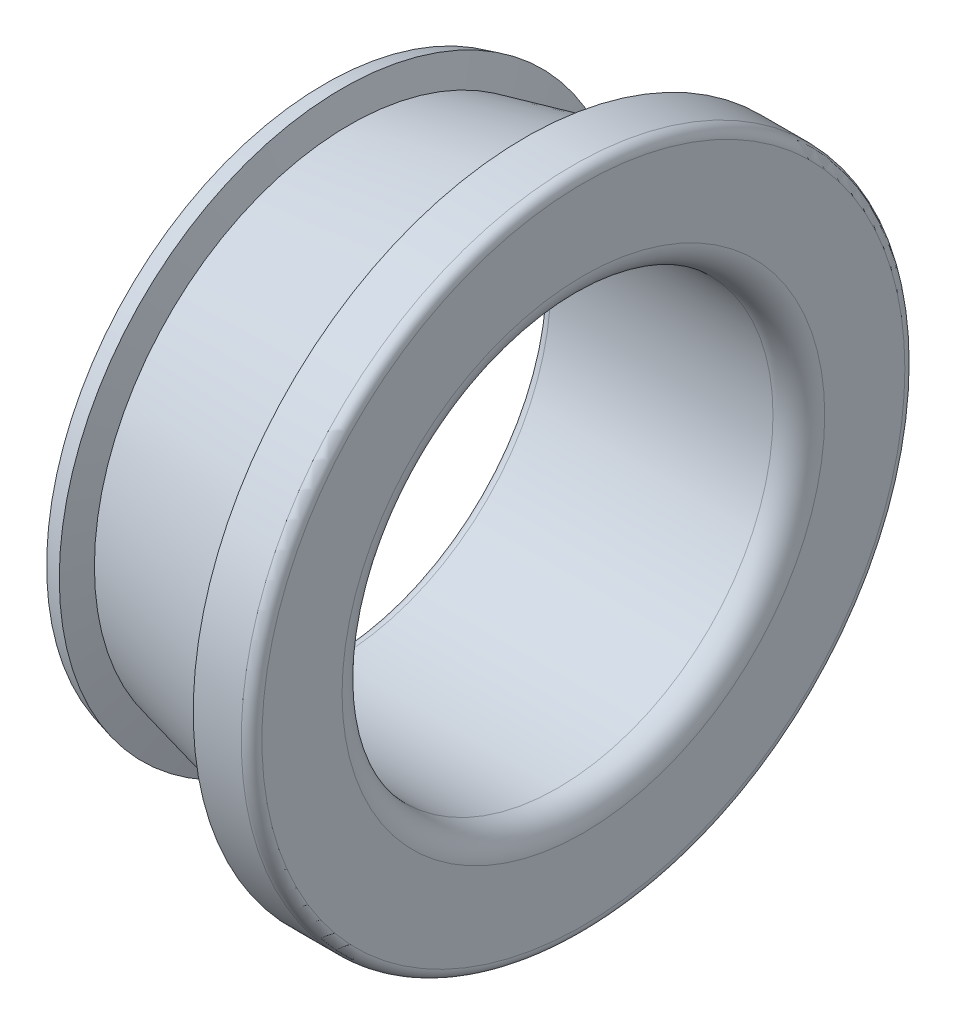
ISO-10303-21;
HEADER;
FILE_DESCRIPTION(('STEP AP214'),'2;1');
FILE_NAME('part.step','',(''),(''),'','','');
FILE_SCHEMA(('AUTOMOTIVE_DESIGN { 1 0 10303 214 1 1 1 1 }'));
ENDSEC;
DATA;
#1=APPLICATION_CONTEXT('core data for automotive mechanical design processes');
#2=APPLICATION_PROTOCOL_DEFINITION('international standard','automotive_design',2000,#1);
#3=PRODUCT_CONTEXT('',#1,'mechanical');
#4=PRODUCT('Part','Part','',(#3));
#5=PRODUCT_RELATED_PRODUCT_CATEGORY('part','',(#4));
#6=PRODUCT_DEFINITION_FORMATION('','',#4);
#7=PRODUCT_DEFINITION_CONTEXT('part definition',#1,'design');
#8=PRODUCT_DEFINITION('design','',#6,#7);
#9=PRODUCT_DEFINITION_SHAPE('','',#8);
#10=(LENGTH_UNIT() NAMED_UNIT(*) SI_UNIT(.MILLI.,.METRE.));
#11=(NAMED_UNIT(*) PLANE_ANGLE_UNIT() SI_UNIT($,.RADIAN.));
#12=(NAMED_UNIT(*) SI_UNIT($,.STERADIAN.) SOLID_ANGLE_UNIT());
#13=UNCERTAINTY_MEASURE_WITH_UNIT(LENGTH_MEASURE(1.E-05),#10,'distance_accuracy_value','');
#14=(GEOMETRIC_REPRESENTATION_CONTEXT(3) GLOBAL_UNCERTAINTY_ASSIGNED_CONTEXT((#13)) GLOBAL_UNIT_ASSIGNED_CONTEXT((#10,
#11,#12)) REPRESENTATION_CONTEXT('',''));
#15=CARTESIAN_POINT('',(0.,0.,0.));
#16=DIRECTION('',(0.,0.,1.));
#17=DIRECTION('',(1.,0.,0.));
#18=AXIS2_PLACEMENT_3D('',#15,#16,#17);
#19=CARTESIAN_POINT('',(-1.5,0.,0.));
#20=DIRECTION('',(1.,0.,0.));
#21=DIRECTION('',(0.,0.,-1.));
#22=AXIS2_PLACEMENT_3D('',#19,#20,#21);
#23=TOROIDAL_SURFACE('',#22,14.,1.5);
#24=CARTESIAN_POINT('',(0.,0.,0.));
#25=DIRECTION('',(1.,0.,0.));
#26=DIRECTION('',(0.,0.,-1.));
#27=AXIS2_PLACEMENT_3D('',#24,#25,#26);
#28=CIRCLE('',#27,14.);
#29=CARTESIAN_POINT('',(0.,0.,-14.));
#30=VERTEX_POINT('',#29);
#31=EDGE_CURVE('E68',#30,#30,#28,.T.);
#32=ORIENTED_EDGE('',*,*,#31,.T.);
#33=EDGE_LOOP('',(#32));
#34=FACE_BOUND('',#33,.T.);
#35=CARTESIAN_POINT('',(-1.5,0.,0.));
#36=DIRECTION('',(1.,0.,0.));
#37=DIRECTION('',(0.,0.,-1.));
#38=AXIS2_PLACEMENT_3D('',#35,#36,#37);
#39=CIRCLE('',#38,12.5);
#40=CARTESIAN_POINT('',(-1.5,0.,-12.5));
#41=VERTEX_POINT('',#40);
#42=EDGE_CURVE('E10',#41,#41,#39,.T.);
#43=ORIENTED_EDGE('',*,*,#42,.F.);
#44=EDGE_LOOP('',(#43));
#45=FACE_BOUND('',#44,.T.);
#46=ADVANCED_FACE('F31',(#34,#45),#23,.T.);
#47=CARTESIAN_POINT('',(0.,0.,0.));
#48=DIRECTION('',(1.,0.,0.));
#49=DIRECTION('',(0.,0.,-1.));
#50=AXIS2_PLACEMENT_3D('',#47,#48,#49);
#51=CYLINDRICAL_SURFACE('',#50,12.5);
#52=ORIENTED_EDGE('',*,*,#42,.T.);
#53=EDGE_LOOP('',(#52));
#54=FACE_BOUND('',#53,.T.);
#55=CARTESIAN_POINT('',(-14.4,0.,0.));
#56=DIRECTION('',(1.,0.,0.));
#57=DIRECTION('',(0.,0.,-1.));
#58=AXIS2_PLACEMENT_3D('',#55,#56,#57);
#59=CIRCLE('',#58,12.5);
#60=CARTESIAN_POINT('',(-14.4,0.,-12.5));
#61=VERTEX_POINT('',#60);
#62=EDGE_CURVE('E37',#61,#61,#59,.T.);
#63=ORIENTED_EDGE('',*,*,#62,.F.);
#64=EDGE_LOOP('',(#63));
#65=FACE_BOUND('',#64,.T.);
#66=ADVANCED_FACE('F86',(#54,#65),#51,.F.);
#67=CARTESIAN_POINT('',(-14.4,0.,0.));
#68=DIRECTION('',(1.,0.,0.));
#69=DIRECTION('',(0.,0.,-1.));
#70=AXIS2_PLACEMENT_3D('',#67,#68,#69);
#71=TOROIDAL_SURFACE('',#70,13.1,0.600000000000001);
#72=ORIENTED_EDGE('',*,*,#62,.T.);
#73=EDGE_LOOP('',(#72));
#74=FACE_BOUND('',#73,.T.);
#75=CARTESIAN_POINT('',(-15.,0.,0.));
#76=DIRECTION('',(1.,0.,0.));
#77=DIRECTION('',(0.,0.,-1.));
#78=AXIS2_PLACEMENT_3D('',#75,#76,#77);
#79=CIRCLE('',#78,13.1);
#80=CARTESIAN_POINT('',(-15.,0.,-13.1));
#81=VERTEX_POINT('',#80);
#82=EDGE_CURVE('E41',#81,#81,#79,.T.);
#83=ORIENTED_EDGE('',*,*,#82,.F.);
#84=EDGE_LOOP('',(#83));
#85=FACE_BOUND('',#84,.T.);
#86=ADVANCED_FACE('F90',(#74,#85),#71,.T.);
#87=CARTESIAN_POINT('',(-15.,13.1,0.));
#88=DIRECTION('',(-1.,0.,0.));
#89=DIRECTION('',(0.,0.,1.));
#90=AXIS2_PLACEMENT_3D('',#87,#88,#89);
#91=PLANE('',#90);
#92=ORIENTED_EDGE('',*,*,#82,.T.);
#93=EDGE_LOOP('',(#92));
#94=FACE_BOUND('',#93,.T.);
#95=CARTESIAN_POINT('',(-15.,0.,0.));
#96=DIRECTION('',(1.,0.,0.));
#97=DIRECTION('',(0.,0.,-1.));
#98=AXIS2_PLACEMENT_3D('',#95,#96,#97);
#99=CIRCLE('',#98,16.1379441906845);
#100=CARTESIAN_POINT('',(-15.,0.,-16.1379441906845));
#101=VERTEX_POINT('',#100);
#102=EDGE_CURVE('E45',#101,#101,#99,.T.);
#103=ORIENTED_EDGE('',*,*,#102,.F.);
#104=EDGE_LOOP('',(#103));
#105=FACE_BOUND('',#104,.T.);
#106=ADVANCED_FACE('F94',(#94,#105),#91,.T.);
#107=CARTESIAN_POINT('',(-14.,0.,0.));
#108=DIRECTION('',(1.,0.,0.));
#109=DIRECTION('',(0.,0.,-1.));
#110=AXIS2_PLACEMENT_3D('',#107,#108,#109);
#111=CONICAL_SURFACE('',#110,16.4058933831156,0.261799387799144);
#112=ORIENTED_EDGE('',*,*,#102,.T.);
#113=EDGE_LOOP('',(#112));
#114=FACE_BOUND('',#113,.T.);
#115=CARTESIAN_POINT('',(-14.,0.,0.));
#116=DIRECTION('',(1.,0.,0.));
#117=DIRECTION('',(0.,0.,-1.));
#118=AXIS2_PLACEMENT_3D('',#115,#116,#117);
#119=CIRCLE('',#118,16.4058933831156);
#120=CARTESIAN_POINT('',(-14.,0.,-16.4058933831156));
#121=VERTEX_POINT('',#120);
#122=EDGE_CURVE('E50',#121,#121,#119,.T.);
#123=ORIENTED_EDGE('',*,*,#122,.F.);
#124=EDGE_LOOP('',(#123));
#125=FACE_BOUND('',#124,.T.);
#126=ADVANCED_FACE('F100',(#114,#125),#111,.T.);
#127=CARTESIAN_POINT('',(-13.5692572260566,0.,0.));
#128=DIRECTION('',(-1.,0.,0.));
#129=DIRECTION('',(0.,0.,1.));
#130=AXIS2_PLACEMENT_3D('',#127,#128,#129);
#131=CONICAL_SURFACE('',#130,14.7983394657656,1.30899693899575);
#132=ORIENTED_EDGE('',*,*,#122,.T.);
#133=EDGE_LOOP('',(#132));
#134=FACE_BOUND('',#133,.T.);
#135=CARTESIAN_POINT('',(-13.5692572260566,0.,0.));
#136=DIRECTION('',(1.,0.,0.));
#137=DIRECTION('',(0.,0.,-1.));
#138=AXIS2_PLACEMENT_3D('',#135,#136,#137);
#139=CIRCLE('',#138,14.7983394657656);
#140=CARTESIAN_POINT('',(-13.5692572260566,0.,-14.7983394657656));
#141=VERTEX_POINT('',#140);
#142=EDGE_CURVE('E53',#141,#141,#139,.T.);
#143=ORIENTED_EDGE('',*,*,#142,.F.);
#144=EDGE_LOOP('',(#143));
#145=FACE_BOUND('',#144,.T.);
#146=ADVANCED_FACE('F104',(#134,#145),#131,.T.);
#147=CARTESIAN_POINT('',(-2.86801151343943,0.,0.));
#148=DIRECTION('',(1.,0.,0.));
#149=DIRECTION('',(0.,0.,-1.));
#150=AXIS2_PLACEMENT_3D('',#147,#148,#149);
#151=CONICAL_SURFACE('',#150,17.3181483474219,0.231256125889249);
#152=ORIENTED_EDGE('',*,*,#142,.T.);
#153=EDGE_LOOP('',(#152));
#154=FACE_BOUND('',#153,.T.);
#155=CARTESIAN_POINT('',(-2.86801151343943,0.,0.));
#156=DIRECTION('',(1.,0.,0.));
#157=DIRECTION('',(0.,0.,-1.));
#158=AXIS2_PLACEMENT_3D('',#155,#156,#157);
#159=CIRCLE('',#158,17.3181483474219);
#160=CARTESIAN_POINT('',(-2.86801151343943,0.,-17.3181483474219));
#161=VERTEX_POINT('',#160);
#162=EDGE_CURVE('E56',#161,#161,#159,.T.);
#163=ORIENTED_EDGE('',*,*,#162,.F.);
#164=EDGE_LOOP('',(#163));
#165=FACE_BOUND('',#164,.T.);
#166=ADVANCED_FACE('F108',(#154,#165),#151,.T.);
#167=CARTESIAN_POINT('',(-3.38564960364446,0.,0.));
#168=DIRECTION('',(-1.,0.,0.));
#169=DIRECTION('',(0.,0.,1.));
#170=AXIS2_PLACEMENT_3D('',#167,#168,#169);
#171=CONICAL_SURFACE('',#170,19.25,1.30899693899575);
#172=ORIENTED_EDGE('',*,*,#162,.T.);
#173=EDGE_LOOP('',(#172));
#174=FACE_BOUND('',#173,.T.);
#175=CARTESIAN_POINT('',(-3.38564960364446,0.,0.));
#176=DIRECTION('',(1.,0.,0.));
#177=DIRECTION('',(0.,0.,-1.));
#178=AXIS2_PLACEMENT_3D('',#175,#176,#177);
#179=CIRCLE('',#178,19.25);
#180=CARTESIAN_POINT('',(-3.38564960364446,0.,-19.25));
#181=VERTEX_POINT('',#180);
#182=EDGE_CURVE('E59',#181,#181,#179,.T.);
#183=ORIENTED_EDGE('',*,*,#182,.F.);
#184=EDGE_LOOP('',(#183));
#185=FACE_BOUND('',#184,.T.);
#186=ADVANCED_FACE('F112',(#174,#185),#171,.F.);
#187=CARTESIAN_POINT('',(0.,0.,0.));
#188=DIRECTION('',(1.,0.,0.));
#189=DIRECTION('',(0.,0.,-1.));
#190=AXIS2_PLACEMENT_3D('',#187,#188,#189);
#191=CYLINDRICAL_SURFACE('',#190,19.25);
#192=ORIENTED_EDGE('',*,*,#182,.T.);
#193=EDGE_LOOP('',(#192));
#194=FACE_BOUND('',#193,.T.);
#195=CARTESIAN_POINT('',(-0.6,0.,0.));
#196=DIRECTION('',(1.,0.,0.));
#197=DIRECTION('',(0.,0.,-1.));
#198=AXIS2_PLACEMENT_3D('',#195,#196,#197);
#199=CIRCLE('',#198,19.25);
#200=CARTESIAN_POINT('',(-0.6,0.,-19.25));
#201=VERTEX_POINT('',#200);
#202=EDGE_CURVE('E62',#201,#201,#199,.T.);
#203=ORIENTED_EDGE('',*,*,#202,.F.);
#204=EDGE_LOOP('',(#203));
#205=FACE_BOUND('',#204,.T.);
#206=ADVANCED_FACE('F82',(#194,#205),#191,.T.);
#207=CARTESIAN_POINT('',(-0.6,0.,0.));
#208=DIRECTION('',(1.,0.,0.));
#209=DIRECTION('',(0.,0.,-1.));
#210=AXIS2_PLACEMENT_3D('',#207,#208,#209);
#211=TOROIDAL_SURFACE('',#210,18.65,0.6);
#212=ORIENTED_EDGE('',*,*,#202,.T.);
#213=EDGE_LOOP('',(#212));
#214=FACE_BOUND('',#213,.T.);
#215=CARTESIAN_POINT('',(0.,0.,0.));
#216=DIRECTION('',(1.,0.,0.));
#217=DIRECTION('',(0.,0.,-1.));
#218=AXIS2_PLACEMENT_3D('',#215,#216,#217);
#219=CIRCLE('',#218,18.65);
#220=CARTESIAN_POINT('',(0.,0.,-18.65));
#221=VERTEX_POINT('',#220);
#222=EDGE_CURVE('E65',#221,#221,#219,.T.);
#223=ORIENTED_EDGE('',*,*,#222,.F.);
#224=EDGE_LOOP('',(#223));
#225=FACE_BOUND('',#224,.T.);
#226=ADVANCED_FACE('F76',(#214,#225),#211,.T.);
#227=CARTESIAN_POINT('',(0.,14.,0.));
#228=DIRECTION('',(1.,0.,0.));
#229=DIRECTION('',(0.,0.,-1.));
#230=AXIS2_PLACEMENT_3D('',#227,#228,#229);
#231=PLANE('',#230);
#232=ORIENTED_EDGE('',*,*,#222,.T.);
#233=EDGE_LOOP('',(#232));
#234=FACE_BOUND('',#233,.T.);
#235=ORIENTED_EDGE('',*,*,#31,.F.);
#236=EDGE_LOOP('',(#235));
#237=FACE_BOUND('',#236,.T.);
#238=ADVANCED_FACE('F74',(#234,#237),#231,.T.);
#239=CLOSED_SHELL('',(#46,#66,#86,#106,#126,#146,#166,#186,#206,#226,#238));
#240=MANIFOLD_SOLID_BREP('B2',#239);
#241=ADVANCED_BREP_SHAPE_REPRESENTATION('',(#18,#240),#14);
#242=SHAPE_DEFINITION_REPRESENTATION(#9,#241);
ENDSEC;
END-ISO-10303-21;
